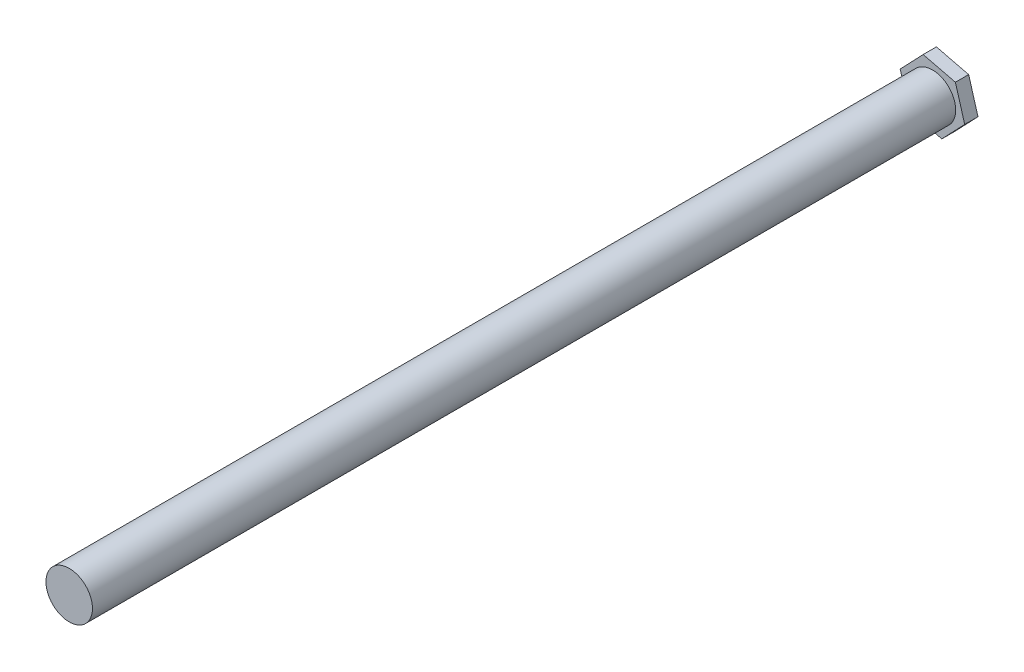
ISO-10303-21;
HEADER;
FILE_DESCRIPTION(('STEP AP214'),'2;1');
FILE_NAME('part.step','',(''),(''),'','','');
FILE_SCHEMA(('AUTOMOTIVE_DESIGN { 1 0 10303 214 1 1 1 1 }'));
ENDSEC;
DATA;
#1=APPLICATION_CONTEXT('core data for automotive mechanical design processes');
#2=APPLICATION_PROTOCOL_DEFINITION('international standard','automotive_design',2000,#1);
#3=PRODUCT_CONTEXT('',#1,'mechanical');
#4=PRODUCT('Part','Part','',(#3));
#5=PRODUCT_RELATED_PRODUCT_CATEGORY('part','',(#4));
#6=PRODUCT_DEFINITION_FORMATION('','',#4);
#7=PRODUCT_DEFINITION_CONTEXT('part definition',#1,'design');
#8=PRODUCT_DEFINITION('design','',#6,#7);
#9=PRODUCT_DEFINITION_SHAPE('','',#8);
#10=(LENGTH_UNIT() NAMED_UNIT(*) SI_UNIT(.MILLI.,.METRE.));
#11=(NAMED_UNIT(*) PLANE_ANGLE_UNIT() SI_UNIT($,.RADIAN.));
#12=(NAMED_UNIT(*) SI_UNIT($,.STERADIAN.) SOLID_ANGLE_UNIT());
#13=UNCERTAINTY_MEASURE_WITH_UNIT(LENGTH_MEASURE(1.E-05),#10,'distance_accuracy_value','');
#14=(GEOMETRIC_REPRESENTATION_CONTEXT(3) GLOBAL_UNCERTAINTY_ASSIGNED_CONTEXT((#13)) GLOBAL_UNIT_ASSIGNED_CONTEXT((#10,
#11,#12)) REPRESENTATION_CONTEXT('',''));
#15=CARTESIAN_POINT('',(0.,0.,0.));
#16=DIRECTION('',(0.,0.,1.));
#17=DIRECTION('',(1.,0.,0.));
#18=AXIS2_PLACEMENT_3D('',#15,#16,#17);
#19=CARTESIAN_POINT('',(0.,0.,33.02));
#20=DIRECTION('',(0.,0.,-1.));
#21=DIRECTION('',(-1.,0.,0.));
#22=AXIS2_PLACEMENT_3D('',#19,#20,#21);
#23=CYLINDRICAL_SURFACE('',#22,0.889);
#24=CARTESIAN_POINT('',(0.,0.,33.02));
#25=DIRECTION('',(0.,0.,1.));
#26=DIRECTION('',(1.,0.,0.));
#27=AXIS2_PLACEMENT_3D('',#24,#25,#26);
#28=CIRCLE('',#27,0.889);
#29=CARTESIAN_POINT('',(0.889,0.,33.02));
#30=VERTEX_POINT('',#29);
#31=EDGE_CURVE('E11',#30,#30,#28,.T.);
#32=ORIENTED_EDGE('',*,*,#31,.F.);
#33=EDGE_LOOP('',(#32));
#34=FACE_BOUND('',#33,.T.);
#35=CARTESIAN_POINT('',(0.,0.,0.));
#36=DIRECTION('',(0.,0.,1.));
#37=DIRECTION('',(1.,0.,0.));
#38=AXIS2_PLACEMENT_3D('',#35,#36,#37);
#39=CIRCLE('',#38,0.889);
#40=CARTESIAN_POINT('',(0.889,0.,0.));
#41=VERTEX_POINT('',#40);
#42=EDGE_CURVE('E44',#41,#41,#39,.T.);
#43=ORIENTED_EDGE('',*,*,#42,.T.);
#44=EDGE_LOOP('',(#43));
#45=FACE_BOUND('',#44,.T.);
#46=ADVANCED_FACE('F41',(#34,#45),#23,.T.);
#47=CARTESIAN_POINT('',(0.,0.,33.02));
#48=DIRECTION('',(0.,0.,1.));
#49=DIRECTION('',(1.,0.,0.));
#50=AXIS2_PLACEMENT_3D('',#47,#48,#49);
#51=PLANE('',#50);
#52=ORIENTED_EDGE('',*,*,#31,.T.);
#53=EDGE_LOOP('',(#52));
#54=FACE_BOUND('',#53,.T.);
#55=ADVANCED_FACE('F168',(#54),#51,.T.);
#56=CARTESIAN_POINT('',(0.357042173842494,-1.21877844011856,-0.508));
#57=DIRECTION('',(0.236363486054535,0.971664706809992,0.));
#58=DIRECTION('',(-0.971664706809992,0.236363486054535,0.));
#59=AXIS2_PLACEMENT_3D('',#56,#57,#58);
#60=PLANE('',#59);
#61=DIRECTION('',(-0.971664706809992,0.236363486054535,0.));
#62=VECTOR('',#61,1.);
#63=CARTESIAN_POINT('',(0.357042173842494,-1.21877844011856,0.));
#64=LINE('',#63,#62);
#65=CARTESIAN_POINT('',(0.357042173842494,-1.21877844011856,0.));
#66=VERTEX_POINT('',#65);
#67=CARTESIAN_POINT('',(-0.876972003806196,-0.918596812829299,0.));
#68=VERTEX_POINT('',#67);
#69=EDGE_CURVE('E126',#66,#68,#64,.T.);
#70=ORIENTED_EDGE('',*,*,#69,.T.);
#71=DIRECTION('',(0.,0.,1.));
#72=VECTOR('',#71,1.);
#73=CARTESIAN_POINT('',(-0.876972003806196,-0.918596812829299,-0.508));
#74=LINE('',#73,#72);
#75=CARTESIAN_POINT('',(-0.876972003806196,-0.918596812829299,-0.508));
#76=VERTEX_POINT('',#75);
#77=EDGE_CURVE('E143',#76,#68,#74,.T.);
#78=ORIENTED_EDGE('',*,*,#77,.F.);
#79=DIRECTION('',(-0.971664706809992,0.236363486054535,0.));
#80=VECTOR('',#79,1.);
#81=CARTESIAN_POINT('',(0.357042173842494,-1.21877844011856,-0.508));
#82=LINE('',#81,#80);
#83=CARTESIAN_POINT('',(0.357042173842494,-1.21877844011856,-0.508));
#84=VERTEX_POINT('',#83);
#85=EDGE_CURVE('E136',#84,#76,#82,.T.);
#86=ORIENTED_EDGE('',*,*,#85,.F.);
#87=DIRECTION('',(0.,0.,1.));
#88=VECTOR('',#87,1.);
#89=CARTESIAN_POINT('',(0.357042173842494,-1.21877844011856,-0.508));
#90=LINE('',#89,#88);
#91=EDGE_CURVE('E122',#84,#66,#90,.T.);
#92=ORIENTED_EDGE('',*,*,#91,.T.);
#93=EDGE_LOOP('',(#70,#78,#86,#92));
#94=FACE_BOUND('',#93,.T.);
#95=ADVANCED_FACE('F156',(#94),#60,.F.);
#96=CARTESIAN_POINT('',(-0.876972003806196,-0.918596812829299,-0.508));
#97=DIRECTION('',(0.959668063085479,0.28113556995472,0.));
#98=DIRECTION('',(-0.28113556995472,0.959668063085479,0.));
#99=AXIS2_PLACEMENT_3D('',#96,#97,#98);
#100=PLANE('',#99);
#101=DIRECTION('',(-0.28113556995472,0.959668063085479,0.));
#102=VECTOR('',#101,1.);
#103=CARTESIAN_POINT('',(-0.876972003806196,-0.918596812829299,0.));
#104=LINE('',#103,#102);
#105=CARTESIAN_POINT('',(-1.23401417764869,0.300181627289259,0.));
#106=VERTEX_POINT('',#105);
#107=EDGE_CURVE('E129',#68,#106,#104,.T.);
#108=ORIENTED_EDGE('',*,*,#107,.T.);
#109=DIRECTION('',(0.,0.,1.));
#110=VECTOR('',#109,1.);
#111=CARTESIAN_POINT('',(-1.23401417764869,0.300181627289259,-0.508));
#112=LINE('',#111,#110);
#113=CARTESIAN_POINT('',(-1.23401417764869,0.300181627289259,-0.508));
#114=VERTEX_POINT('',#113);
#115=EDGE_CURVE('E140',#114,#106,#112,.T.);
#116=ORIENTED_EDGE('',*,*,#115,.F.);
#117=DIRECTION('',(-0.28113556995472,0.959668063085479,0.));
#118=VECTOR('',#117,1.);
#119=CARTESIAN_POINT('',(-0.876972003806196,-0.918596812829299,-0.508));
#120=LINE('',#119,#118);
#121=EDGE_CURVE('E95',#76,#114,#120,.T.);
#122=ORIENTED_EDGE('',*,*,#121,.F.);
#123=ORIENTED_EDGE('',*,*,#77,.T.);
#124=EDGE_LOOP('',(#108,#116,#122,#123));
#125=FACE_BOUND('',#124,.T.);
#126=ADVANCED_FACE('F178',(#125),#100,.F.);
#127=CARTESIAN_POINT('',(-1.23401417764869,0.300181627289259,-0.508));
#128=DIRECTION('',(0.723304577030944,-0.690529136855272,0.));
#129=DIRECTION('',(0.690529136855272,0.723304577030944,0.));
#130=AXIS2_PLACEMENT_3D('',#127,#128,#129);
#131=PLANE('',#130);
#132=DIRECTION('',(0.690529136855272,0.723304577030944,0.));
#133=VECTOR('',#132,1.);
#134=CARTESIAN_POINT('',(-1.23401417764869,0.300181627289259,0.));
#135=LINE('',#134,#133);
#136=CARTESIAN_POINT('',(-0.357042173842494,1.21877844011856,0.));
#137=VERTEX_POINT('',#136);
#138=EDGE_CURVE('E131',#106,#137,#135,.T.);
#139=ORIENTED_EDGE('',*,*,#138,.T.);
#140=DIRECTION('',(0.,0.,1.));
#141=VECTOR('',#140,1.);
#142=CARTESIAN_POINT('',(-0.357042173842494,1.21877844011856,-0.508));
#143=LINE('',#142,#141);
#144=CARTESIAN_POINT('',(-0.357042173842494,1.21877844011856,-0.508));
#145=VERTEX_POINT('',#144);
#146=EDGE_CURVE('E117',#145,#137,#143,.T.);
#147=ORIENTED_EDGE('',*,*,#146,.F.);
#148=DIRECTION('',(0.690529136855272,0.723304577030944,0.));
#149=VECTOR('',#148,1.);
#150=CARTESIAN_POINT('',(-1.23401417764869,0.300181627289259,-0.508));
#151=LINE('',#150,#149);
#152=EDGE_CURVE('E108',#114,#145,#151,.T.);
#153=ORIENTED_EDGE('',*,*,#152,.F.);
#154=ORIENTED_EDGE('',*,*,#115,.T.);
#155=EDGE_LOOP('',(#139,#147,#153,#154));
#156=FACE_BOUND('',#155,.T.);
#157=ADVANCED_FACE('F183',(#156),#131,.F.);
#158=CARTESIAN_POINT('',(-0.357042173842494,1.21877844011856,-0.508));
#159=DIRECTION('',(-0.236363486054535,-0.971664706809992,0.));
#160=DIRECTION('',(0.971664706809992,-0.236363486054535,0.));
#161=AXIS2_PLACEMENT_3D('',#158,#159,#160);
#162=PLANE('',#161);
#163=DIRECTION('',(0.971664706809992,-0.236363486054535,0.));
#164=VECTOR('',#163,1.);
#165=CARTESIAN_POINT('',(-0.357042173842494,1.21877844011856,0.));
#166=LINE('',#165,#164);
#167=CARTESIAN_POINT('',(0.876972003806195,0.918596812829299,0.));
#168=VERTEX_POINT('',#167);
#169=EDGE_CURVE('E116',#137,#168,#166,.T.);
#170=ORIENTED_EDGE('',*,*,#169,.T.);
#171=DIRECTION('',(0.,0.,1.));
#172=VECTOR('',#171,1.);
#173=CARTESIAN_POINT('',(0.876972003806195,0.918596812829299,-0.508));
#174=LINE('',#173,#172);
#175=CARTESIAN_POINT('',(0.876972003806195,0.918596812829299,-0.508));
#176=VERTEX_POINT('',#175);
#177=EDGE_CURVE('E113',#176,#168,#174,.T.);
#178=ORIENTED_EDGE('',*,*,#177,.F.);
#179=DIRECTION('',(0.971664706809992,-0.236363486054535,0.));
#180=VECTOR('',#179,1.);
#181=CARTESIAN_POINT('',(-0.357042173842494,1.21877844011856,-0.508));
#182=LINE('',#181,#180);
#183=EDGE_CURVE('E102',#145,#176,#182,.T.);
#184=ORIENTED_EDGE('',*,*,#183,.F.);
#185=ORIENTED_EDGE('',*,*,#146,.T.);
#186=EDGE_LOOP('',(#170,#178,#184,#185));
#187=FACE_BOUND('',#186,.T.);
#188=ADVANCED_FACE('F114',(#187),#162,.F.);
#189=CARTESIAN_POINT('',(0.876972003806195,0.918596812829299,-0.508));
#190=DIRECTION('',(-0.959668063085479,-0.28113556995472,0.));
#191=DIRECTION('',(0.28113556995472,-0.959668063085479,0.));
#192=AXIS2_PLACEMENT_3D('',#189,#190,#191);
#193=PLANE('',#192);
#194=DIRECTION('',(0.28113556995472,-0.959668063085479,0.));
#195=VECTOR('',#194,1.);
#196=CARTESIAN_POINT('',(0.876972003806195,0.918596812829299,0.));
#197=LINE('',#196,#195);
#198=CARTESIAN_POINT('',(1.23401417764869,-0.300181627289259,0.));
#199=VERTEX_POINT('',#198);
#200=EDGE_CURVE('E80',#168,#199,#197,.T.);
#201=ORIENTED_EDGE('',*,*,#200,.T.);
#202=DIRECTION('',(0.,0.,1.));
#203=VECTOR('',#202,1.);
#204=CARTESIAN_POINT('',(1.23401417764869,-0.300181627289259,-0.508));
#205=LINE('',#204,#203);
#206=CARTESIAN_POINT('',(1.23401417764869,-0.300181627289259,-0.508));
#207=VERTEX_POINT('',#206);
#208=EDGE_CURVE('E118',#207,#199,#205,.T.);
#209=ORIENTED_EDGE('',*,*,#208,.F.);
#210=DIRECTION('',(0.28113556995472,-0.959668063085479,0.));
#211=VECTOR('',#210,1.);
#212=CARTESIAN_POINT('',(0.876972003806195,0.918596812829299,-0.508));
#213=LINE('',#212,#211);
#214=EDGE_CURVE('E106',#176,#207,#213,.T.);
#215=ORIENTED_EDGE('',*,*,#214,.F.);
#216=ORIENTED_EDGE('',*,*,#177,.T.);
#217=EDGE_LOOP('',(#201,#209,#215,#216));
#218=FACE_BOUND('',#217,.T.);
#219=ADVANCED_FACE('F120',(#218),#193,.F.);
#220=CARTESIAN_POINT('',(1.23401417764869,-0.300181627289259,-0.508));
#221=DIRECTION('',(-0.723304577030944,0.690529136855272,0.));
#222=DIRECTION('',(-0.690529136855272,-0.723304577030944,0.));
#223=AXIS2_PLACEMENT_3D('',#220,#221,#222);
#224=PLANE('',#223);
#225=DIRECTION('',(-0.690529136855272,-0.723304577030944,0.));
#226=VECTOR('',#225,1.);
#227=CARTESIAN_POINT('',(1.23401417764869,-0.300181627289259,0.));
#228=LINE('',#227,#226);
#229=EDGE_CURVE('E86',#199,#66,#228,.T.);
#230=ORIENTED_EDGE('',*,*,#229,.T.);
#231=ORIENTED_EDGE('',*,*,#91,.F.);
#232=DIRECTION('',(-0.690529136855272,-0.723304577030944,0.));
#233=VECTOR('',#232,1.);
#234=CARTESIAN_POINT('',(1.23401417764869,-0.300181627289259,-0.508));
#235=LINE('',#234,#233);
#236=EDGE_CURVE('E57',#207,#84,#235,.T.);
#237=ORIENTED_EDGE('',*,*,#236,.F.);
#238=ORIENTED_EDGE('',*,*,#208,.T.);
#239=EDGE_LOOP('',(#230,#231,#237,#238));
#240=FACE_BOUND('',#239,.T.);
#241=ADVANCED_FACE('F158',(#240),#224,.F.);
#242=CARTESIAN_POINT('',(0.,0.,-0.508));
#243=DIRECTION('',(0.,0.,-1.));
#244=DIRECTION('',(-1.,0.,0.));
#245=AXIS2_PLACEMENT_3D('',#242,#243,#244);
#246=PLANE('',#245);
#247=ORIENTED_EDGE('',*,*,#85,.T.);
#248=ORIENTED_EDGE('',*,*,#121,.T.);
#249=ORIENTED_EDGE('',*,*,#152,.T.);
#250=ORIENTED_EDGE('',*,*,#183,.T.);
#251=ORIENTED_EDGE('',*,*,#214,.T.);
#252=ORIENTED_EDGE('',*,*,#236,.T.);
#253=EDGE_LOOP('',(#247,#248,#249,#250,#251,#252));
#254=FACE_BOUND('',#253,.T.);
#255=ADVANCED_FACE('F104',(#254),#246,.T.);
#256=CARTESIAN_POINT('',(0.,0.,0.));
#257=DIRECTION('',(0.,0.,-1.));
#258=DIRECTION('',(-1.,0.,0.));
#259=AXIS2_PLACEMENT_3D('',#256,#257,#258);
#260=PLANE('',#259);
#261=ORIENTED_EDGE('',*,*,#42,.F.);
#262=EDGE_LOOP('',(#261));
#263=FACE_BOUND('',#262,.T.);
#264=ORIENTED_EDGE('',*,*,#69,.F.);
#265=ORIENTED_EDGE('',*,*,#229,.F.);
#266=ORIENTED_EDGE('',*,*,#200,.F.);
#267=ORIENTED_EDGE('',*,*,#169,.F.);
#268=ORIENTED_EDGE('',*,*,#138,.F.);
#269=ORIENTED_EDGE('',*,*,#107,.F.);
#270=EDGE_LOOP('',(#264,#265,#266,#267,#268,#269));
#271=FACE_BOUND('',#270,.T.);
#272=ADVANCED_FACE('F149',(#263,#271),#260,.F.);
#273=CLOSED_SHELL('',(#46,#55,#95,#126,#157,#188,#219,#241,#255,#272));
#274=MANIFOLD_SOLID_BREP('B2',#273);
#275=ADVANCED_BREP_SHAPE_REPRESENTATION('',(#18,#274),#14);
#276=SHAPE_DEFINITION_REPRESENTATION(#9,#275);
ENDSEC;
END-ISO-10303-21;
